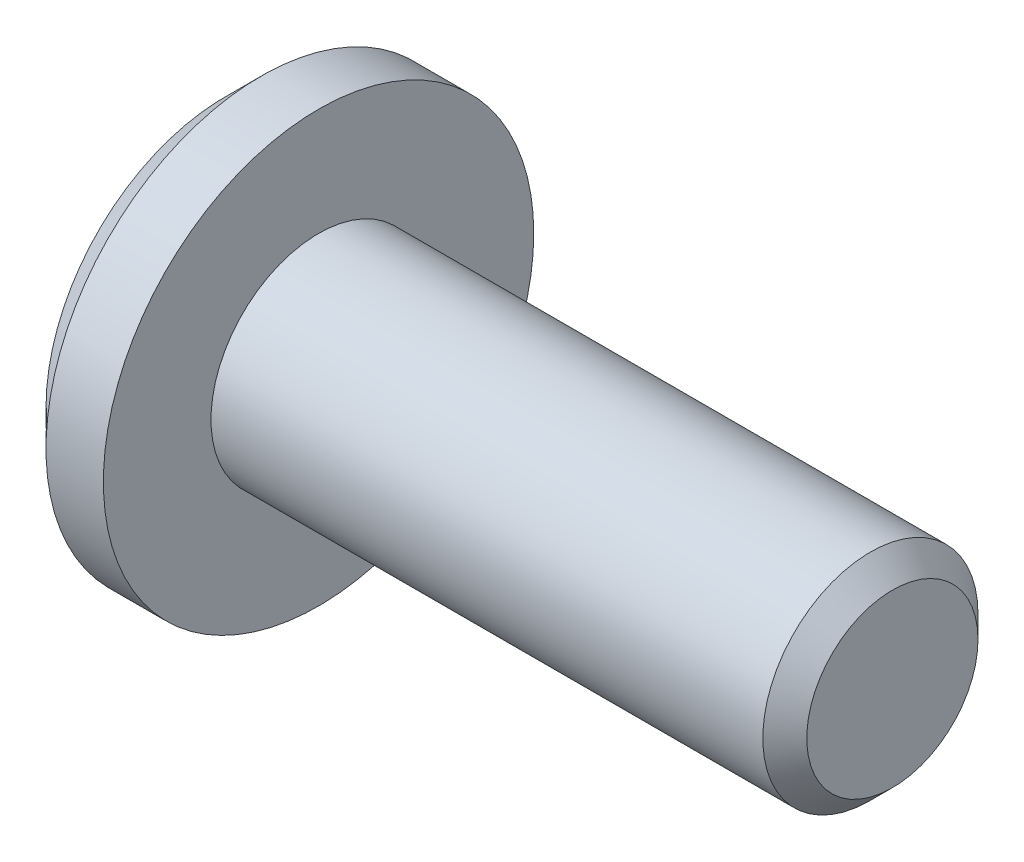
ISO-10303-21;
HEADER;
FILE_DESCRIPTION(('STEP AP214'),'2;1');
FILE_NAME('part.step','',(''),(''),'','','');
FILE_SCHEMA(('AUTOMOTIVE_DESIGN { 1 0 10303 214 1 1 1 1 }'));
ENDSEC;
DATA;
#1=APPLICATION_CONTEXT('core data for automotive mechanical design processes');
#2=APPLICATION_PROTOCOL_DEFINITION('international standard','automotive_design',2000,#1);
#3=PRODUCT_CONTEXT('',#1,'mechanical');
#4=PRODUCT('Part','Part','',(#3));
#5=PRODUCT_RELATED_PRODUCT_CATEGORY('part','',(#4));
#6=PRODUCT_DEFINITION_FORMATION('','',#4);
#7=PRODUCT_DEFINITION_CONTEXT('part definition',#1,'design');
#8=PRODUCT_DEFINITION('design','',#6,#7);
#9=PRODUCT_DEFINITION_SHAPE('','',#8);
#10=(LENGTH_UNIT() NAMED_UNIT(*) SI_UNIT(.MILLI.,.METRE.));
#11=(NAMED_UNIT(*) PLANE_ANGLE_UNIT() SI_UNIT($,.RADIAN.));
#12=(NAMED_UNIT(*) SI_UNIT($,.STERADIAN.) SOLID_ANGLE_UNIT());
#13=UNCERTAINTY_MEASURE_WITH_UNIT(LENGTH_MEASURE(1.E-05),#10,'distance_accuracy_value','');
#14=(GEOMETRIC_REPRESENTATION_CONTEXT(3) GLOBAL_UNCERTAINTY_ASSIGNED_CONTEXT((#13)) GLOBAL_UNIT_ASSIGNED_CONTEXT((#10,
#11,#12)) REPRESENTATION_CONTEXT('',''));
#15=CARTESIAN_POINT('',(0.,0.,0.));
#16=DIRECTION('',(0.,0.,1.));
#17=DIRECTION('',(1.,0.,0.));
#18=AXIS2_PLACEMENT_3D('',#15,#16,#17);
#19=CARTESIAN_POINT('',(-1.3,0.,0.));
#20=DIRECTION('',(1.,0.,0.));
#21=DIRECTION('',(0.,0.,-1.));
#22=AXIS2_PLACEMENT_3D('',#19,#20,#21);
#23=PLANE('',#22);
#24=CARTESIAN_POINT('',(-1.3,0.,0.));
#25=DIRECTION('',(1.,0.,0.));
#26=DIRECTION('',(0.,0.,-1.));
#27=AXIS2_PLACEMENT_3D('',#24,#25,#26);
#28=CIRCLE('',#27,2.5);
#29=CARTESIAN_POINT('',(-1.3,0.,-2.5));
#30=VERTEX_POINT('',#29);
#31=EDGE_CURVE('E13',#30,#30,#28,.F.);
#32=ORIENTED_EDGE('',*,*,#31,.T.);
#33=EDGE_LOOP('',(#32));
#34=FACE_BOUND('',#33,.T.);
#35=DIRECTION('',(0.,-1.,0.));
#36=VECTOR('',#35,1.);
#37=CARTESIAN_POINT('',(-1.3,0.43301270189222,0.75));
#38=LINE('',#37,#36);
#39=CARTESIAN_POINT('',(-1.3,0.43301270189222,0.75));
#40=VERTEX_POINT('',#39);
#41=CARTESIAN_POINT('',(-1.3,-0.43301270189222,0.75));
#42=VERTEX_POINT('',#41);
#43=EDGE_CURVE('E123',#40,#42,#38,.T.);
#44=ORIENTED_EDGE('',*,*,#43,.T.);
#45=DIRECTION('',(0.,-0.5,-0.866025403784438));
#46=VECTOR('',#45,1.);
#47=CARTESIAN_POINT('',(-1.3,-0.43301270189222,0.75));
#48=LINE('',#47,#46);
#49=CARTESIAN_POINT('',(-1.3,-0.86602540378444,0.));
#50=VERTEX_POINT('',#49);
#51=EDGE_CURVE('E112',#42,#50,#48,.T.);
#52=ORIENTED_EDGE('',*,*,#51,.T.);
#53=DIRECTION('',(0.,0.5,-0.866025403784438));
#54=VECTOR('',#53,1.);
#55=CARTESIAN_POINT('',(-1.3,-0.86602540378444,0.));
#56=LINE('',#55,#54);
#57=CARTESIAN_POINT('',(-1.3,-0.43301270189222,-0.75));
#58=VERTEX_POINT('',#57);
#59=EDGE_CURVE('E125',#50,#58,#56,.T.);
#60=ORIENTED_EDGE('',*,*,#59,.T.);
#61=DIRECTION('',(0.,1.,0.));
#62=VECTOR('',#61,1.);
#63=CARTESIAN_POINT('',(-1.3,-0.43301270189222,-0.75));
#64=LINE('',#63,#62);
#65=CARTESIAN_POINT('',(-1.3,0.43301270189222,-0.75));
#66=VERTEX_POINT('',#65);
#67=EDGE_CURVE('E148',#58,#66,#64,.T.);
#68=ORIENTED_EDGE('',*,*,#67,.T.);
#69=DIRECTION('',(0.,0.5,0.866025403784438));
#70=VECTOR('',#69,1.);
#71=CARTESIAN_POINT('',(-1.3,0.43301270189222,-0.75));
#72=LINE('',#71,#70);
#73=CARTESIAN_POINT('',(-1.3,0.86602540378444,0.));
#74=VERTEX_POINT('',#73);
#75=EDGE_CURVE('E155',#66,#74,#72,.T.);
#76=ORIENTED_EDGE('',*,*,#75,.T.);
#77=DIRECTION('',(0.,-0.5,0.866025403784438));
#78=VECTOR('',#77,1.);
#79=CARTESIAN_POINT('',(-1.3,0.86602540378444,0.));
#80=LINE('',#79,#78);
#81=EDGE_CURVE('E137',#74,#40,#80,.T.);
#82=ORIENTED_EDGE('',*,*,#81,.T.);
#83=EDGE_LOOP('',(#44,#52,#60,#68,#76,#82));
#84=FACE_BOUND('',#83,.T.);
#85=ADVANCED_FACE('F60',(#34,#84),#23,.F.);
#86=CARTESIAN_POINT('',(5.,0.,0.));
#87=DIRECTION('',(1.,0.,0.));
#88=DIRECTION('',(0.,0.,-1.));
#89=AXIS2_PLACEMENT_3D('',#86,#87,#88);
#90=CYLINDRICAL_SURFACE('',#89,3.);
#91=CARTESIAN_POINT('',(-0.8,0.,0.));
#92=DIRECTION('',(1.,0.,0.));
#93=DIRECTION('',(0.,0.,-1.));
#94=AXIS2_PLACEMENT_3D('',#91,#92,#93);
#95=CIRCLE('',#94,3.);
#96=CARTESIAN_POINT('',(-0.8,0.,-3.));
#97=VERTEX_POINT('',#96);
#98=EDGE_CURVE('E70',#97,#97,#95,.T.);
#99=ORIENTED_EDGE('',*,*,#98,.T.);
#100=EDGE_LOOP('',(#99));
#101=FACE_BOUND('',#100,.T.);
#102=CARTESIAN_POINT('',(0.,0.,0.));
#103=DIRECTION('',(1.,0.,0.));
#104=DIRECTION('',(0.,0.,-1.));
#105=AXIS2_PLACEMENT_3D('',#102,#103,#104);
#106=CIRCLE('',#105,3.);
#107=CARTESIAN_POINT('',(0.,0.,-3.));
#108=VERTEX_POINT('',#107);
#109=EDGE_CURVE('E161',#108,#108,#106,.T.);
#110=ORIENTED_EDGE('',*,*,#109,.F.);
#111=EDGE_LOOP('',(#110));
#112=FACE_BOUND('',#111,.T.);
#113=ADVANCED_FACE('F236',(#101,#112),#90,.T.);
#114=CARTESIAN_POINT('',(0.,3.,0.));
#115=DIRECTION('',(-1.,0.,0.));
#116=DIRECTION('',(0.,0.,1.));
#117=AXIS2_PLACEMENT_3D('',#114,#115,#116);
#118=PLANE('',#117);
#119=CARTESIAN_POINT('',(0.,0.,0.));
#120=DIRECTION('',(1.,0.,0.));
#121=DIRECTION('',(0.,0.,-1.));
#122=AXIS2_PLACEMENT_3D('',#119,#120,#121);
#123=CIRCLE('',#122,1.5);
#124=CARTESIAN_POINT('',(0.,0.,-1.5));
#125=VERTEX_POINT('',#124);
#126=EDGE_CURVE('E170',#125,#125,#123,.T.);
#127=ORIENTED_EDGE('',*,*,#126,.F.);
#128=EDGE_LOOP('',(#127));
#129=FACE_BOUND('',#128,.T.);
#130=ORIENTED_EDGE('',*,*,#109,.T.);
#131=EDGE_LOOP('',(#130));
#132=FACE_BOUND('',#131,.T.);
#133=ADVANCED_FACE('F256',(#129,#132),#118,.F.);
#134=CARTESIAN_POINT('',(5.,0.,0.));
#135=DIRECTION('',(1.,0.,0.));
#136=DIRECTION('',(0.,0.,-1.));
#137=AXIS2_PLACEMENT_3D('',#134,#135,#136);
#138=CYLINDRICAL_SURFACE('',#137,1.5);
#139=CARTESIAN_POINT('',(7.6935,0.,0.));
#140=DIRECTION('',(1.,0.,0.));
#141=DIRECTION('',(0.,0.,-1.));
#142=AXIS2_PLACEMENT_3D('',#139,#140,#141);
#143=CIRCLE('',#142,1.5);
#144=CARTESIAN_POINT('',(7.6935,0.,-1.5));
#145=VERTEX_POINT('',#144);
#146=EDGE_CURVE('E174',#145,#145,#143,.T.);
#147=ORIENTED_EDGE('',*,*,#146,.F.);
#148=EDGE_LOOP('',(#147));
#149=FACE_BOUND('',#148,.T.);
#150=ORIENTED_EDGE('',*,*,#126,.T.);
#151=EDGE_LOOP('',(#150));
#152=FACE_BOUND('',#151,.T.);
#153=ADVANCED_FACE('F263',(#149,#152),#138,.T.);
#154=CARTESIAN_POINT('',(7.6935,0.,0.));
#155=DIRECTION('',(-1.,0.,0.));
#156=DIRECTION('',(0.,0.,1.));
#157=AXIS2_PLACEMENT_3D('',#154,#155,#156);
#158=CONICAL_SURFACE('',#157,1.5,0.785398163397448);
#159=CARTESIAN_POINT('',(8.,0.,0.));
#160=DIRECTION('',(1.,0.,0.));
#161=DIRECTION('',(0.,0.,-1.));
#162=AXIS2_PLACEMENT_3D('',#159,#160,#161);
#163=CIRCLE('',#162,1.1935);
#164=CARTESIAN_POINT('',(8.,0.,-1.1935));
#165=VERTEX_POINT('',#164);
#166=EDGE_CURVE('E172',#165,#165,#163,.T.);
#167=ORIENTED_EDGE('',*,*,#166,.F.);
#168=EDGE_LOOP('',(#167));
#169=FACE_BOUND('',#168,.T.);
#170=ORIENTED_EDGE('',*,*,#146,.T.);
#171=EDGE_LOOP('',(#170));
#172=FACE_BOUND('',#171,.T.);
#173=ADVANCED_FACE('F270',(#169,#172),#158,.T.);
#174=CARTESIAN_POINT('',(8.,1.1935,0.));
#175=DIRECTION('',(-1.,0.,0.));
#176=DIRECTION('',(0.,0.,1.));
#177=AXIS2_PLACEMENT_3D('',#174,#175,#176);
#178=PLANE('',#177);
#179=ORIENTED_EDGE('',*,*,#166,.T.);
#180=EDGE_LOOP('',(#179));
#181=FACE_BOUND('',#180,.T.);
#182=ADVANCED_FACE('F271',(#181),#178,.F.);
#183=CARTESIAN_POINT('',(0.7,0.43301270189222,0.75));
#184=DIRECTION('',(0.,0.,-1.));
#185=DIRECTION('',(-1.,0.,0.));
#186=AXIS2_PLACEMENT_3D('',#183,#184,#185);
#187=PLANE('',#186);
#188=ORIENTED_EDGE('',*,*,#43,.F.);
#189=DIRECTION('',(-1.,0.,0.));
#190=VECTOR('',#189,1.);
#191=CARTESIAN_POINT('',(0.7,0.43301270189222,0.75));
#192=LINE('',#191,#190);
#193=CARTESIAN_POINT('',(0.7,0.43301270189222,0.75));
#194=VERTEX_POINT('',#193);
#195=EDGE_CURVE('E171',#194,#40,#192,.T.);
#196=ORIENTED_EDGE('',*,*,#195,.F.);
#197=DIRECTION('',(0.,-1.,0.));
#198=VECTOR('',#197,1.);
#199=CARTESIAN_POINT('',(0.7,0.43301270189222,0.75));
#200=LINE('',#199,#198);
#201=CARTESIAN_POINT('',(0.7,-0.43301270189222,0.75));
#202=VERTEX_POINT('',#201);
#203=EDGE_CURVE('E128',#194,#202,#200,.T.);
#204=ORIENTED_EDGE('',*,*,#203,.T.);
#205=DIRECTION('',(-1.,0.,0.));
#206=VECTOR('',#205,1.);
#207=CARTESIAN_POINT('',(0.7,-0.43301270189222,0.75));
#208=LINE('',#207,#206);
#209=EDGE_CURVE('E113',#202,#42,#208,.T.);
#210=ORIENTED_EDGE('',*,*,#209,.T.);
#211=EDGE_LOOP('',(#188,#196,#204,#210));
#212=FACE_BOUND('',#211,.T.);
#213=ADVANCED_FACE('F126',(#212),#187,.T.);
#214=CARTESIAN_POINT('',(0.7,-0.43301270189222,0.75));
#215=DIRECTION('',(0.,0.866025403784439,-0.5));
#216=DIRECTION('',(0.,0.5,0.866025403784439));
#217=AXIS2_PLACEMENT_3D('',#214,#215,#216);
#218=PLANE('',#217);
#219=ORIENTED_EDGE('',*,*,#51,.F.);
#220=ORIENTED_EDGE('',*,*,#209,.F.);
#221=DIRECTION('',(0.,-0.5,-0.866025403784438));
#222=VECTOR('',#221,1.);
#223=CARTESIAN_POINT('',(0.7,-0.43301270189222,0.75));
#224=LINE('',#223,#222);
#225=CARTESIAN_POINT('',(0.7,-0.86602540378444,0.));
#226=VERTEX_POINT('',#225);
#227=EDGE_CURVE('E131',#202,#226,#224,.T.);
#228=ORIENTED_EDGE('',*,*,#227,.T.);
#229=DIRECTION('',(-1.,0.,0.));
#230=VECTOR('',#229,1.);
#231=CARTESIAN_POINT('',(0.7,-0.86602540378444,0.));
#232=LINE('',#231,#230);
#233=EDGE_CURVE('E116',#226,#50,#232,.T.);
#234=ORIENTED_EDGE('',*,*,#233,.T.);
#235=EDGE_LOOP('',(#219,#220,#228,#234));
#236=FACE_BOUND('',#235,.T.);
#237=ADVANCED_FACE('F114',(#236),#218,.T.);
#238=CARTESIAN_POINT('',(0.7,-0.86602540378444,0.));
#239=DIRECTION('',(0.,0.866025403784439,0.5));
#240=DIRECTION('',(0.,-0.5,0.866025403784439));
#241=AXIS2_PLACEMENT_3D('',#238,#239,#240);
#242=PLANE('',#241);
#243=ORIENTED_EDGE('',*,*,#59,.F.);
#244=ORIENTED_EDGE('',*,*,#233,.F.);
#245=DIRECTION('',(0.,0.5,-0.866025403784438));
#246=VECTOR('',#245,1.);
#247=CARTESIAN_POINT('',(0.7,-0.86602540378444,0.));
#248=LINE('',#247,#246);
#249=CARTESIAN_POINT('',(0.7,-0.43301270189222,-0.75));
#250=VERTEX_POINT('',#249);
#251=EDGE_CURVE('E187',#226,#250,#248,.T.);
#252=ORIENTED_EDGE('',*,*,#251,.T.);
#253=DIRECTION('',(-1.,0.,0.));
#254=VECTOR('',#253,1.);
#255=CARTESIAN_POINT('',(0.7,-0.43301270189222,-0.75));
#256=LINE('',#255,#254);
#257=EDGE_CURVE('E198',#250,#58,#256,.T.);
#258=ORIENTED_EDGE('',*,*,#257,.T.);
#259=EDGE_LOOP('',(#243,#244,#252,#258));
#260=FACE_BOUND('',#259,.T.);
#261=ADVANCED_FACE('F273',(#260),#242,.T.);
#262=CARTESIAN_POINT('',(0.7,-0.43301270189222,-0.75));
#263=DIRECTION('',(0.,0.,1.));
#264=DIRECTION('',(1.,0.,0.));
#265=AXIS2_PLACEMENT_3D('',#262,#263,#264);
#266=PLANE('',#265);
#267=ORIENTED_EDGE('',*,*,#67,.F.);
#268=ORIENTED_EDGE('',*,*,#257,.F.);
#269=DIRECTION('',(0.,1.,0.));
#270=VECTOR('',#269,1.);
#271=CARTESIAN_POINT('',(0.7,-0.43301270189222,-0.75));
#272=LINE('',#271,#270);
#273=CARTESIAN_POINT('',(0.7,0.43301270189222,-0.75));
#274=VERTEX_POINT('',#273);
#275=EDGE_CURVE('E205',#250,#274,#272,.T.);
#276=ORIENTED_EDGE('',*,*,#275,.T.);
#277=DIRECTION('',(-1.,0.,0.));
#278=VECTOR('',#277,1.);
#279=CARTESIAN_POINT('',(0.7,0.43301270189222,-0.75));
#280=LINE('',#279,#278);
#281=EDGE_CURVE('E210',#274,#66,#280,.T.);
#282=ORIENTED_EDGE('',*,*,#281,.T.);
#283=EDGE_LOOP('',(#267,#268,#276,#282));
#284=FACE_BOUND('',#283,.T.);
#285=ADVANCED_FACE('F280',(#284),#266,.T.);
#286=CARTESIAN_POINT('',(0.7,0.43301270189222,-0.75));
#287=DIRECTION('',(0.,-0.866025403784439,0.5));
#288=DIRECTION('',(0.,-0.5,-0.866025403784439));
#289=AXIS2_PLACEMENT_3D('',#286,#287,#288);
#290=PLANE('',#289);
#291=ORIENTED_EDGE('',*,*,#75,.F.);
#292=ORIENTED_EDGE('',*,*,#281,.F.);
#293=DIRECTION('',(0.,0.5,0.866025403784438));
#294=VECTOR('',#293,1.);
#295=CARTESIAN_POINT('',(0.7,0.43301270189222,-0.75));
#296=LINE('',#295,#294);
#297=CARTESIAN_POINT('',(0.7,0.86602540378444,0.));
#298=VERTEX_POINT('',#297);
#299=EDGE_CURVE('E80',#274,#298,#296,.T.);
#300=ORIENTED_EDGE('',*,*,#299,.T.);
#301=DIRECTION('',(-1.,0.,0.));
#302=VECTOR('',#301,1.);
#303=CARTESIAN_POINT('',(0.7,0.86602540378444,0.));
#304=LINE('',#303,#302);
#305=EDGE_CURVE('E220',#298,#74,#304,.T.);
#306=ORIENTED_EDGE('',*,*,#305,.T.);
#307=EDGE_LOOP('',(#291,#292,#300,#306));
#308=FACE_BOUND('',#307,.T.);
#309=ADVANCED_FACE('F278',(#308),#290,.T.);
#310=CARTESIAN_POINT('',(0.7,0.86602540378444,0.));
#311=DIRECTION('',(0.,-0.866025403784439,-0.5));
#312=DIRECTION('',(0.,0.5,-0.866025403784439));
#313=AXIS2_PLACEMENT_3D('',#310,#311,#312);
#314=PLANE('',#313);
#315=ORIENTED_EDGE('',*,*,#81,.F.);
#316=ORIENTED_EDGE('',*,*,#305,.F.);
#317=DIRECTION('',(0.,-0.5,0.866025403784438));
#318=VECTOR('',#317,1.);
#319=CARTESIAN_POINT('',(0.7,0.86602540378444,0.));
#320=LINE('',#319,#318);
#321=EDGE_CURVE('E74',#298,#194,#320,.T.);
#322=ORIENTED_EDGE('',*,*,#321,.T.);
#323=ORIENTED_EDGE('',*,*,#195,.T.);
#324=EDGE_LOOP('',(#315,#316,#322,#323));
#325=FACE_BOUND('',#324,.T.);
#326=ADVANCED_FACE('F248',(#325),#314,.T.);
#327=CARTESIAN_POINT('',(0.7,0.,0.));
#328=DIRECTION('',(1.,0.,0.));
#329=DIRECTION('',(0.,0.,-1.));
#330=AXIS2_PLACEMENT_3D('',#327,#328,#329);
#331=PLANE('',#330);
#332=ORIENTED_EDGE('',*,*,#203,.F.);
#333=ORIENTED_EDGE('',*,*,#321,.F.);
#334=ORIENTED_EDGE('',*,*,#299,.F.);
#335=ORIENTED_EDGE('',*,*,#275,.F.);
#336=ORIENTED_EDGE('',*,*,#251,.F.);
#337=ORIENTED_EDGE('',*,*,#227,.F.);
#338=EDGE_LOOP('',(#332,#333,#334,#335,#336,#337));
#339=FACE_BOUND('',#338,.T.);
#340=ADVANCED_FACE('F241',(#339),#331,.F.);
#341=CARTESIAN_POINT('',(-0.8,0.,0.));
#342=DIRECTION('',(1.,0.,0.));
#343=DIRECTION('',(0.,0.,-1.));
#344=AXIS2_PLACEMENT_3D('',#341,#342,#343);
#345=CONICAL_SURFACE('',#344,3.,0.785398163397449);
#346=ORIENTED_EDGE('',*,*,#31,.F.);
#347=EDGE_LOOP('',(#346));
#348=FACE_BOUND('',#347,.T.);
#349=ORIENTED_EDGE('',*,*,#98,.F.);
#350=EDGE_LOOP('',(#349));
#351=FACE_BOUND('',#350,.T.);
#352=ADVANCED_FACE('F58',(#348,#351),#345,.T.);
#353=CLOSED_SHELL('',(#85,#113,#133,#153,#173,#182,#213,#237,#261,#285,#309,#326,#340,#352));
#354=MANIFOLD_SOLID_BREP('B2',#353);
#355=ADVANCED_BREP_SHAPE_REPRESENTATION('',(#18,#354),#14);
#356=SHAPE_DEFINITION_REPRESENTATION(#9,#355);
ENDSEC;
END-ISO-10303-21;
